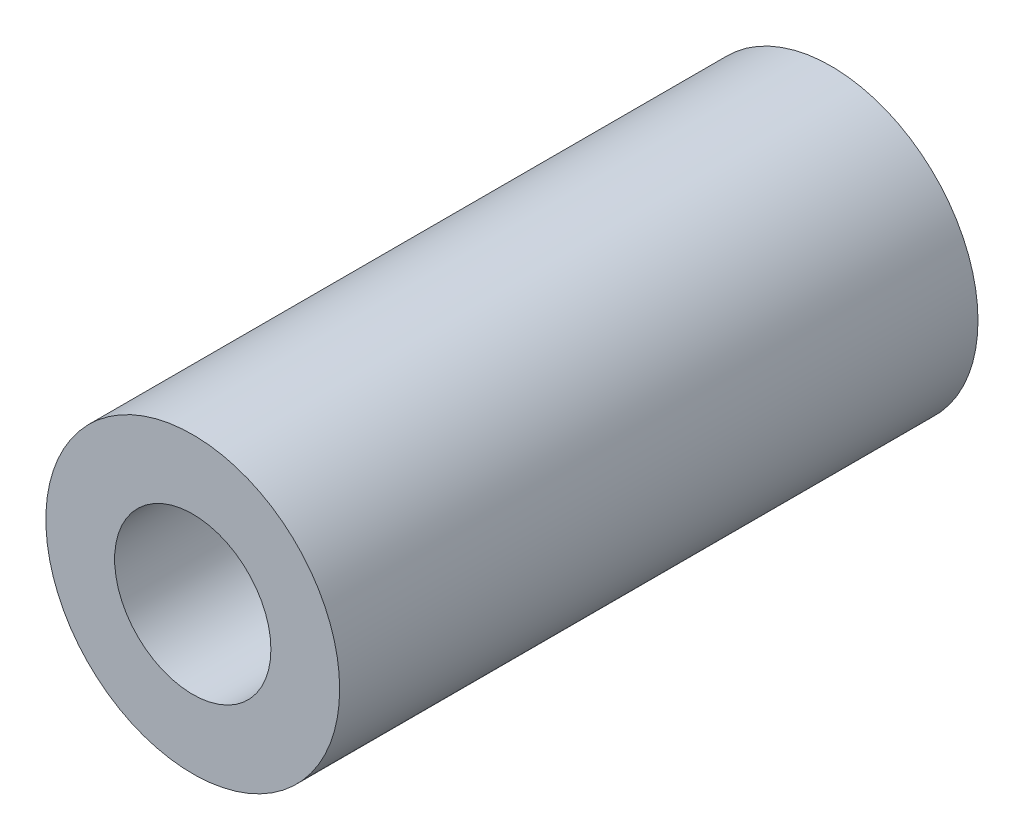
ISO-10303-21;
HEADER;
FILE_DESCRIPTION(('STEP AP214'),'2;1');
FILE_NAME('part.step','',(''),(''),'','','');
FILE_SCHEMA(('AUTOMOTIVE_DESIGN { 1 0 10303 214 1 1 1 1 }'));
ENDSEC;
DATA;
#1=APPLICATION_CONTEXT('core data for automotive mechanical design processes');
#2=APPLICATION_PROTOCOL_DEFINITION('international standard','automotive_design',2000,#1);
#3=PRODUCT_CONTEXT('',#1,'mechanical');
#4=PRODUCT('Part','Part','',(#3));
#5=PRODUCT_RELATED_PRODUCT_CATEGORY('part','',(#4));
#6=PRODUCT_DEFINITION_FORMATION('','',#4);
#7=PRODUCT_DEFINITION_CONTEXT('part definition',#1,'design');
#8=PRODUCT_DEFINITION('design','',#6,#7);
#9=PRODUCT_DEFINITION_SHAPE('','',#8);
#10=(LENGTH_UNIT() NAMED_UNIT(*) SI_UNIT(.MILLI.,.METRE.));
#11=(NAMED_UNIT(*) PLANE_ANGLE_UNIT() SI_UNIT($,.RADIAN.));
#12=(NAMED_UNIT(*) SI_UNIT($,.STERADIAN.) SOLID_ANGLE_UNIT());
#13=UNCERTAINTY_MEASURE_WITH_UNIT(LENGTH_MEASURE(1.E-05),#10,'distance_accuracy_value','');
#14=(GEOMETRIC_REPRESENTATION_CONTEXT(3) GLOBAL_UNCERTAINTY_ASSIGNED_CONTEXT((#13)) GLOBAL_UNIT_ASSIGNED_CONTEXT((#10,
#11,#12)) REPRESENTATION_CONTEXT('',''));
#15=CARTESIAN_POINT('',(0.,0.,0.));
#16=DIRECTION('',(0.,0.,1.));
#17=DIRECTION('',(1.,0.,0.));
#18=AXIS2_PLACEMENT_3D('',#15,#16,#17);
#19=CARTESIAN_POINT('',(0.,0.,0.));
#20=DIRECTION('',(0.,0.,1.));
#21=DIRECTION('',(1.,0.,0.));
#22=AXIS2_PLACEMENT_3D('',#19,#20,#21);
#23=CYLINDRICAL_SURFACE('',#22,3.3782);
#24=CARTESIAN_POINT('',(0.,0.,-28.100250124));
#25=DIRECTION('',(0.,0.,1.));
#26=DIRECTION('',(1.,0.,0.));
#27=AXIS2_PLACEMENT_3D('',#24,#25,#26);
#28=CIRCLE('',#27,3.3782);
#29=CARTESIAN_POINT('',(3.3782,0.,-28.100250124));
#30=VERTEX_POINT('',#29);
#31=EDGE_CURVE('E55',#30,#30,#28,.T.);
#32=ORIENTED_EDGE('',*,*,#31,.F.);
#33=EDGE_LOOP('',(#32));
#34=FACE_BOUND('',#33,.T.);
#35=CARTESIAN_POINT('',(0.,0.,0.));
#36=DIRECTION('',(0.,0.,1.));
#37=DIRECTION('',(1.,0.,0.));
#38=AXIS2_PLACEMENT_3D('',#35,#36,#37);
#39=CIRCLE('',#38,3.3782);
#40=CARTESIAN_POINT('',(3.3782,0.,0.));
#41=VERTEX_POINT('',#40);
#42=EDGE_CURVE('E10',#41,#41,#39,.T.);
#43=ORIENTED_EDGE('',*,*,#42,.T.);
#44=EDGE_LOOP('',(#43));
#45=FACE_BOUND('',#44,.T.);
#46=ADVANCED_FACE('F33',(#34,#45),#23,.F.);
#47=CARTESIAN_POINT('',(0.,3.3782,0.));
#48=DIRECTION('',(0.,0.,-1.));
#49=DIRECTION('',(-1.,0.,0.));
#50=AXIS2_PLACEMENT_3D('',#47,#48,#49);
#51=PLANE('',#50);
#52=ORIENTED_EDGE('',*,*,#42,.F.);
#53=EDGE_LOOP('',(#52));
#54=FACE_BOUND('',#53,.T.);
#55=CARTESIAN_POINT('',(0.,0.,0.));
#56=DIRECTION('',(0.,0.,1.));
#57=DIRECTION('',(1.,0.,0.));
#58=AXIS2_PLACEMENT_3D('',#55,#56,#57);
#59=CIRCLE('',#58,6.35);
#60=CARTESIAN_POINT('',(6.35,0.,0.));
#61=VERTEX_POINT('',#60);
#62=EDGE_CURVE('E39',#61,#61,#59,.T.);
#63=ORIENTED_EDGE('',*,*,#62,.T.);
#64=EDGE_LOOP('',(#63));
#65=FACE_BOUND('',#64,.T.);
#66=ADVANCED_FACE('F62',(#54,#65),#51,.F.);
#67=CARTESIAN_POINT('',(0.,0.,0.));
#68=DIRECTION('',(0.,0.,1.));
#69=DIRECTION('',(1.,0.,0.));
#70=AXIS2_PLACEMENT_3D('',#67,#68,#69);
#71=CYLINDRICAL_SURFACE('',#70,6.35);
#72=ORIENTED_EDGE('',*,*,#62,.F.);
#73=EDGE_LOOP('',(#72));
#74=FACE_BOUND('',#73,.T.);
#75=CARTESIAN_POINT('',(0.,0.,-27.592250124));
#76=DIRECTION('',(0.,0.,1.));
#77=DIRECTION('',(1.,0.,0.));
#78=AXIS2_PLACEMENT_3D('',#75,#76,#77);
#79=CIRCLE('',#78,6.35);
#80=CARTESIAN_POINT('',(6.35,0.,-27.592250124));
#81=VERTEX_POINT('',#80);
#82=EDGE_CURVE('E43',#81,#81,#79,.T.);
#83=ORIENTED_EDGE('',*,*,#82,.T.);
#84=EDGE_LOOP('',(#83));
#85=FACE_BOUND('',#84,.T.);
#86=ADVANCED_FACE('F66',(#74,#85),#71,.T.);
#87=CARTESIAN_POINT('',(0.,6.35,-27.592250124));
#88=DIRECTION('',(0.,0.,1.));
#89=DIRECTION('',(1.,0.,0.));
#90=AXIS2_PLACEMENT_3D('',#87,#88,#89);
#91=PLANE('',#90);
#92=ORIENTED_EDGE('',*,*,#82,.F.);
#93=EDGE_LOOP('',(#92));
#94=FACE_BOUND('',#93,.T.);
#95=CARTESIAN_POINT('',(0.,0.,-27.592250124));
#96=DIRECTION('',(0.,0.,1.));
#97=DIRECTION('',(1.,0.,0.));
#98=AXIS2_PLACEMENT_3D('',#95,#96,#97);
#99=CIRCLE('',#98,4.6736);
#100=CARTESIAN_POINT('',(4.6736,0.,-27.592250124));
#101=VERTEX_POINT('',#100);
#102=EDGE_CURVE('E47',#101,#101,#99,.T.);
#103=ORIENTED_EDGE('',*,*,#102,.T.);
#104=EDGE_LOOP('',(#103));
#105=FACE_BOUND('',#104,.T.);
#106=ADVANCED_FACE('F71',(#94,#105),#91,.F.);
#107=CARTESIAN_POINT('',(0.,0.,0.));
#108=DIRECTION('',(0.,0.,1.));
#109=DIRECTION('',(1.,0.,0.));
#110=AXIS2_PLACEMENT_3D('',#107,#108,#109);
#111=CYLINDRICAL_SURFACE('',#110,4.6736);
#112=ORIENTED_EDGE('',*,*,#102,.F.);
#113=EDGE_LOOP('',(#112));
#114=FACE_BOUND('',#113,.T.);
#115=CARTESIAN_POINT('',(0.,0.,-28.100250124));
#116=DIRECTION('',(0.,0.,1.));
#117=DIRECTION('',(1.,0.,0.));
#118=AXIS2_PLACEMENT_3D('',#115,#116,#117);
#119=CIRCLE('',#118,4.6736);
#120=CARTESIAN_POINT('',(4.6736,0.,-28.100250124));
#121=VERTEX_POINT('',#120);
#122=EDGE_CURVE('E52',#121,#121,#119,.T.);
#123=ORIENTED_EDGE('',*,*,#122,.T.);
#124=EDGE_LOOP('',(#123));
#125=FACE_BOUND('',#124,.T.);
#126=ADVANCED_FACE('F77',(#114,#125),#111,.T.);
#127=CARTESIAN_POINT('',(0.,4.6736,-28.100250124));
#128=DIRECTION('',(0.,0.,1.));
#129=DIRECTION('',(1.,0.,0.));
#130=AXIS2_PLACEMENT_3D('',#127,#128,#129);
#131=PLANE('',#130);
#132=ORIENTED_EDGE('',*,*,#122,.F.);
#133=EDGE_LOOP('',(#132));
#134=FACE_BOUND('',#133,.T.);
#135=ORIENTED_EDGE('',*,*,#31,.T.);
#136=EDGE_LOOP('',(#135));
#137=FACE_BOUND('',#136,.T.);
#138=ADVANCED_FACE('F59',(#134,#137),#131,.F.);
#139=CLOSED_SHELL('',(#46,#66,#86,#106,#126,#138));
#140=MANIFOLD_SOLID_BREP('B2',#139);
#141=ADVANCED_BREP_SHAPE_REPRESENTATION('',(#18,#140),#14);
#142=SHAPE_DEFINITION_REPRESENTATION(#9,#141);
ENDSEC;
END-ISO-10303-21;
